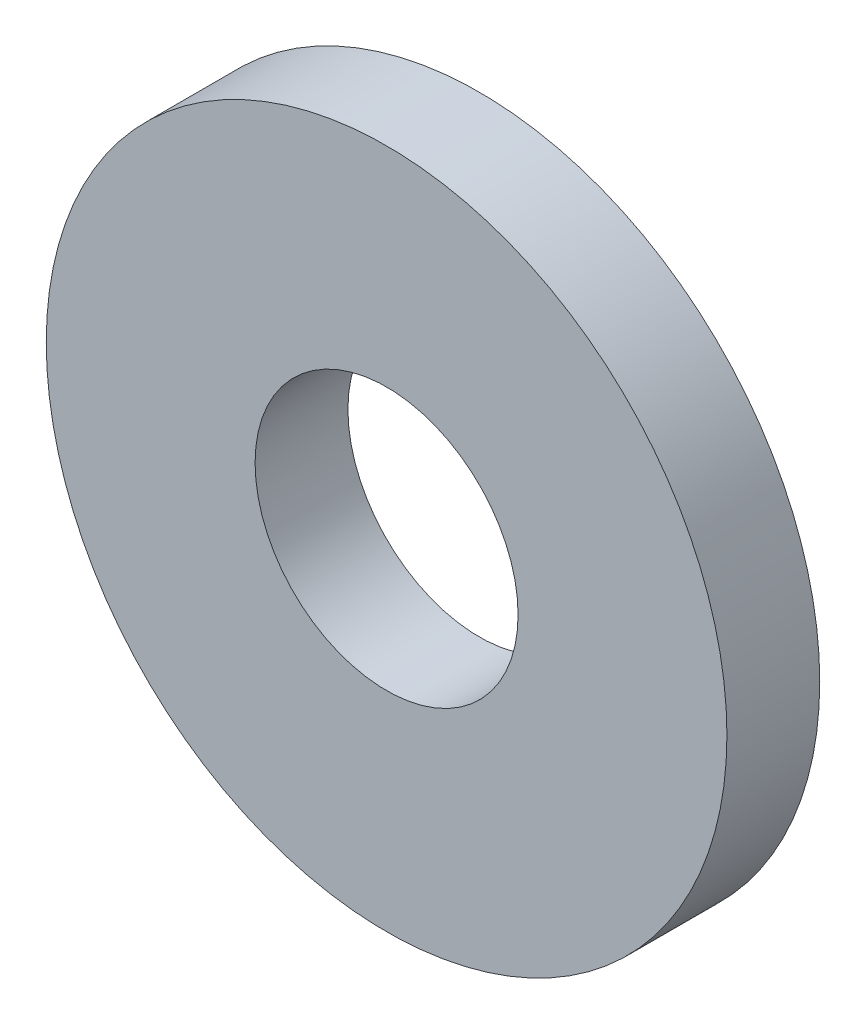
ISO-10303-21;
HEADER;
FILE_DESCRIPTION(('STEP AP214'),'2;1');
FILE_NAME('part.step','',(''),(''),'','','');
FILE_SCHEMA(('AUTOMOTIVE_DESIGN { 1 0 10303 214 1 1 1 1 }'));
ENDSEC;
DATA;
#1=APPLICATION_CONTEXT('core data for automotive mechanical design processes');
#2=APPLICATION_PROTOCOL_DEFINITION('international standard','automotive_design',2000,#1);
#3=PRODUCT_CONTEXT('',#1,'mechanical');
#4=PRODUCT('Part','Part','',(#3));
#5=PRODUCT_RELATED_PRODUCT_CATEGORY('part','',(#4));
#6=PRODUCT_DEFINITION_FORMATION('','',#4);
#7=PRODUCT_DEFINITION_CONTEXT('part definition',#1,'design');
#8=PRODUCT_DEFINITION('design','',#6,#7);
#9=PRODUCT_DEFINITION_SHAPE('','',#8);
#10=(LENGTH_UNIT() NAMED_UNIT(*) SI_UNIT(.MILLI.,.METRE.));
#11=(NAMED_UNIT(*) PLANE_ANGLE_UNIT() SI_UNIT($,.RADIAN.));
#12=(NAMED_UNIT(*) SI_UNIT($,.STERADIAN.) SOLID_ANGLE_UNIT());
#13=UNCERTAINTY_MEASURE_WITH_UNIT(LENGTH_MEASURE(1.E-05),#10,'distance_accuracy_value','');
#14=(GEOMETRIC_REPRESENTATION_CONTEXT(3) GLOBAL_UNCERTAINTY_ASSIGNED_CONTEXT((#13)) GLOBAL_UNIT_ASSIGNED_CONTEXT((#10,
#11,#12)) REPRESENTATION_CONTEXT('',''));
#15=CARTESIAN_POINT('',(0.,0.,0.));
#16=DIRECTION('',(0.,0.,1.));
#17=DIRECTION('',(1.,0.,0.));
#18=AXIS2_PLACEMENT_3D('',#15,#16,#17);
#19=CARTESIAN_POINT('',(0.,0.,-3.));
#20=DIRECTION('',(0.,0.,1.));
#21=DIRECTION('',(1.,0.,0.));
#22=AXIS2_PLACEMENT_3D('',#19,#20,#21);
#23=CYLINDRICAL_SURFACE('',#22,11.);
#24=CARTESIAN_POINT('',(0.,0.,-3.));
#25=DIRECTION('',(0.,0.,1.));
#26=DIRECTION('',(1.,0.,0.));
#27=AXIS2_PLACEMENT_3D('',#24,#25,#26);
#28=CIRCLE('',#27,11.);
#29=CARTESIAN_POINT('',(11.,0.,-3.));
#30=VERTEX_POINT('',#29);
#31=EDGE_CURVE('E10',#30,#30,#28,.T.);
#32=ORIENTED_EDGE('',*,*,#31,.T.);
#33=EDGE_LOOP('',(#32));
#34=FACE_BOUND('',#33,.T.);
#35=CARTESIAN_POINT('',(0.,0.,0.));
#36=DIRECTION('',(0.,0.,1.));
#37=DIRECTION('',(1.,0.,0.));
#38=AXIS2_PLACEMENT_3D('',#35,#36,#37);
#39=CIRCLE('',#38,11.);
#40=CARTESIAN_POINT('',(11.,0.,0.));
#41=VERTEX_POINT('',#40);
#42=EDGE_CURVE('E33',#41,#41,#39,.T.);
#43=ORIENTED_EDGE('',*,*,#42,.F.);
#44=EDGE_LOOP('',(#43));
#45=FACE_BOUND('',#44,.T.);
#46=ADVANCED_FACE('F30',(#34,#45),#23,.T.);
#47=CARTESIAN_POINT('',(0.,0.,-3.));
#48=DIRECTION('',(0.,0.,1.));
#49=DIRECTION('',(1.,0.,0.));
#50=AXIS2_PLACEMENT_3D('',#47,#48,#49);
#51=PLANE('',#50);
#52=CARTESIAN_POINT('',(0.,0.,-3.));
#53=DIRECTION('',(0.,0.,1.));
#54=DIRECTION('',(1.,0.,0.));
#55=AXIS2_PLACEMENT_3D('',#52,#53,#54);
#56=CIRCLE('',#55,4.25);
#57=CARTESIAN_POINT('',(4.25,0.,-3.));
#58=VERTEX_POINT('',#57);
#59=EDGE_CURVE('E40',#58,#58,#56,.T.);
#60=ORIENTED_EDGE('',*,*,#59,.T.);
#61=EDGE_LOOP('',(#60));
#62=FACE_BOUND('',#61,.T.);
#63=ORIENTED_EDGE('',*,*,#31,.F.);
#64=EDGE_LOOP('',(#63));
#65=FACE_BOUND('',#64,.T.);
#66=ADVANCED_FACE('F48',(#62,#65),#51,.F.);
#67=CARTESIAN_POINT('',(0.,0.,0.));
#68=DIRECTION('',(0.,0.,1.));
#69=DIRECTION('',(1.,0.,0.));
#70=AXIS2_PLACEMENT_3D('',#67,#68,#69);
#71=PLANE('',#70);
#72=CARTESIAN_POINT('',(0.,0.,0.));
#73=DIRECTION('',(0.,0.,1.));
#74=DIRECTION('',(1.,0.,0.));
#75=AXIS2_PLACEMENT_3D('',#72,#73,#74);
#76=CIRCLE('',#75,4.25);
#77=CARTESIAN_POINT('',(4.25,0.,0.));
#78=VERTEX_POINT('',#77);
#79=EDGE_CURVE('E42',#78,#78,#76,.T.);
#80=ORIENTED_EDGE('',*,*,#79,.F.);
#81=EDGE_LOOP('',(#80));
#82=FACE_BOUND('',#81,.T.);
#83=ORIENTED_EDGE('',*,*,#42,.T.);
#84=EDGE_LOOP('',(#83));
#85=FACE_BOUND('',#84,.T.);
#86=ADVANCED_FACE('F54',(#82,#85),#71,.T.);
#87=CARTESIAN_POINT('',(0.,0.,-3.));
#88=DIRECTION('',(0.,0.,1.));
#89=DIRECTION('',(1.,0.,0.));
#90=AXIS2_PLACEMENT_3D('',#87,#88,#89);
#91=CYLINDRICAL_SURFACE('',#90,4.25);
#92=ORIENTED_EDGE('',*,*,#59,.F.);
#93=EDGE_LOOP('',(#92));
#94=FACE_BOUND('',#93,.T.);
#95=ORIENTED_EDGE('',*,*,#79,.T.);
#96=EDGE_LOOP('',(#95));
#97=FACE_BOUND('',#96,.T.);
#98=ADVANCED_FACE('F51',(#94,#97),#91,.F.);
#99=CLOSED_SHELL('',(#46,#66,#86,#98));
#100=MANIFOLD_SOLID_BREP('B2',#99);
#101=ADVANCED_BREP_SHAPE_REPRESENTATION('',(#18,#100),#14);
#102=SHAPE_DEFINITION_REPRESENTATION(#9,#101);
ENDSEC;
END-ISO-10303-21;
